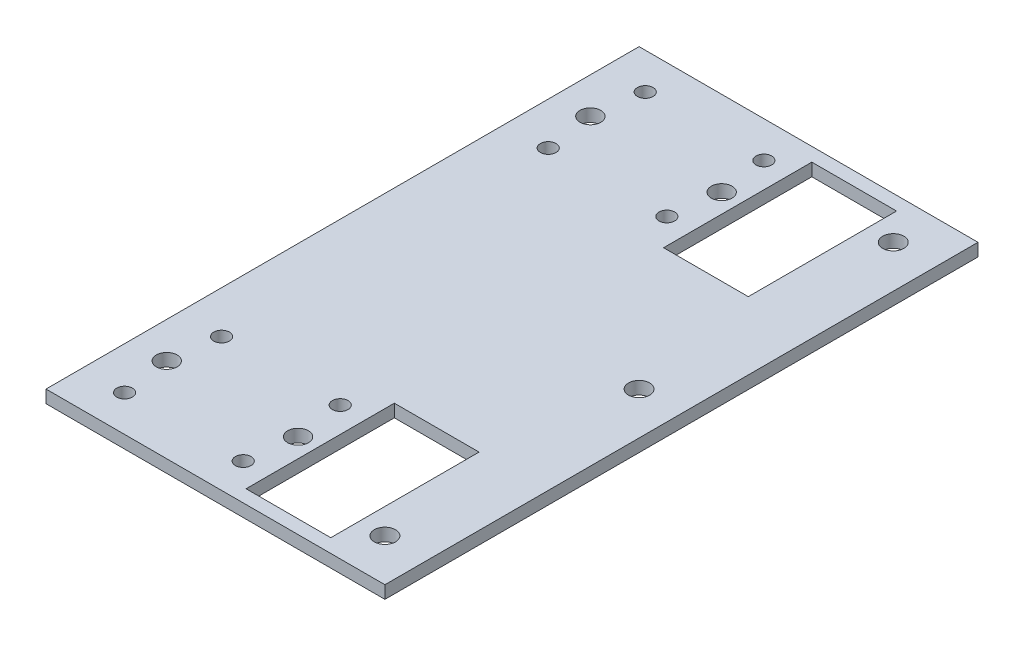
ISO-10303-21;
HEADER;
FILE_DESCRIPTION(('STEP AP214'),'2;1');
FILE_NAME('part.step','',(''),(''),'','','');
FILE_SCHEMA(('AUTOMOTIVE_DESIGN { 1 0 10303 214 1 1 1 1 }'));
ENDSEC;
DATA;
#1=APPLICATION_CONTEXT('core data for automotive mechanical design processes');
#2=APPLICATION_PROTOCOL_DEFINITION('international standard','automotive_design',2000,#1);
#3=PRODUCT_CONTEXT('',#1,'mechanical');
#4=PRODUCT('Part','Part','',(#3));
#5=PRODUCT_RELATED_PRODUCT_CATEGORY('part','',(#4));
#6=PRODUCT_DEFINITION_FORMATION('','',#4);
#7=PRODUCT_DEFINITION_CONTEXT('part definition',#1,'design');
#8=PRODUCT_DEFINITION('design','',#6,#7);
#9=PRODUCT_DEFINITION_SHAPE('','',#8);
#10=(LENGTH_UNIT() NAMED_UNIT(*) SI_UNIT(.MILLI.,.METRE.));
#11=(NAMED_UNIT(*) PLANE_ANGLE_UNIT() SI_UNIT($,.RADIAN.));
#12=(NAMED_UNIT(*) SI_UNIT($,.STERADIAN.) SOLID_ANGLE_UNIT());
#13=UNCERTAINTY_MEASURE_WITH_UNIT(LENGTH_MEASURE(1.E-05),#10,'distance_accuracy_value','');
#14=(GEOMETRIC_REPRESENTATION_CONTEXT(3) GLOBAL_UNCERTAINTY_ASSIGNED_CONTEXT((#13)) GLOBAL_UNIT_ASSIGNED_CONTEXT((#10,
#11,#12)) REPRESENTATION_CONTEXT('',''));
#15=CARTESIAN_POINT('',(0.,0.,0.));
#16=DIRECTION('',(0.,0.,1.));
#17=DIRECTION('',(1.,0.,0.));
#18=AXIS2_PLACEMENT_3D('',#15,#16,#17);
#19=CARTESIAN_POINT('',(40.,3.,0.));
#20=DIRECTION('',(-1.,0.,0.));
#21=DIRECTION('',(0.,0.,1.));
#22=AXIS2_PLACEMENT_3D('',#19,#20,#21);
#23=PLANE('',#22);
#24=DIRECTION('',(0.,0.,-1.));
#25=VECTOR('',#24,1.);
#26=CARTESIAN_POINT('',(40.,0.,0.));
#27=LINE('',#26,#25);
#28=CARTESIAN_POINT('',(40.,0.,70.));
#29=VERTEX_POINT('',#28);
#30=CARTESIAN_POINT('',(40.,0.,-70.));
#31=VERTEX_POINT('',#30);
#32=EDGE_CURVE('E294',#29,#31,#27,.T.);
#33=ORIENTED_EDGE('',*,*,#32,.T.);
#34=DIRECTION('',(0.,-1.,0.));
#35=VECTOR('',#34,1.);
#36=CARTESIAN_POINT('',(40.,3.,-70.));
#37=LINE('',#36,#35);
#38=CARTESIAN_POINT('',(40.,3.,-70.));
#39=VERTEX_POINT('',#38);
#40=EDGE_CURVE('E361',#39,#31,#37,.T.);
#41=ORIENTED_EDGE('',*,*,#40,.F.);
#42=DIRECTION('',(0.,0.,-1.));
#43=VECTOR('',#42,1.);
#44=CARTESIAN_POINT('',(40.,3.,0.));
#45=LINE('',#44,#43);
#46=CARTESIAN_POINT('',(40.,3.,70.));
#47=VERTEX_POINT('',#46);
#48=EDGE_CURVE('E220',#47,#39,#45,.T.);
#49=ORIENTED_EDGE('',*,*,#48,.F.);
#50=DIRECTION('',(0.,-1.,0.));
#51=VECTOR('',#50,1.);
#52=CARTESIAN_POINT('',(40.,3.,70.));
#53=LINE('',#52,#51);
#54=EDGE_CURVE('E278',#47,#29,#53,.T.);
#55=ORIENTED_EDGE('',*,*,#54,.T.);
#56=EDGE_LOOP('',(#33,#41,#49,#55));
#57=FACE_BOUND('',#56,.T.);
#58=ADVANCED_FACE('F46',(#57),#23,.F.);
#59=CARTESIAN_POINT('',(0.,3.,-70.));
#60=DIRECTION('',(0.,0.,-1.));
#61=DIRECTION('',(-1.,0.,0.));
#62=AXIS2_PLACEMENT_3D('',#59,#60,#61);
#63=PLANE('',#62);
#64=DIRECTION('',(1.,0.,0.));
#65=VECTOR('',#64,1.);
#66=CARTESIAN_POINT('',(0.,0.,-70.));
#67=LINE('',#66,#65);
#68=CARTESIAN_POINT('',(-40.,0.,-70.));
#69=VERTEX_POINT('',#68);
#70=EDGE_CURVE('E298',#69,#31,#67,.T.);
#71=ORIENTED_EDGE('',*,*,#70,.F.);
#72=DIRECTION('',(0.,-1.,0.));
#73=VECTOR('',#72,1.);
#74=CARTESIAN_POINT('',(-40.,3.,-70.));
#75=LINE('',#74,#73);
#76=CARTESIAN_POINT('',(-40.,3.,-70.));
#77=VERTEX_POINT('',#76);
#78=EDGE_CURVE('E358',#77,#69,#75,.T.);
#79=ORIENTED_EDGE('',*,*,#78,.F.);
#80=DIRECTION('',(1.,0.,0.));
#81=VECTOR('',#80,1.);
#82=CARTESIAN_POINT('',(0.,3.,-70.));
#83=LINE('',#82,#81);
#84=EDGE_CURVE('E223',#77,#39,#83,.T.);
#85=ORIENTED_EDGE('',*,*,#84,.T.);
#86=ORIENTED_EDGE('',*,*,#40,.T.);
#87=EDGE_LOOP('',(#71,#79,#85,#86));
#88=FACE_BOUND('',#87,.T.);
#89=ADVANCED_FACE('F407',(#88),#63,.T.);
#90=CARTESIAN_POINT('',(-40.,3.,0.));
#91=DIRECTION('',(-1.,0.,0.));
#92=DIRECTION('',(0.,0.,1.));
#93=AXIS2_PLACEMENT_3D('',#90,#91,#92);
#94=PLANE('',#93);
#95=DIRECTION('',(0.,0.,-1.));
#96=VECTOR('',#95,1.);
#97=CARTESIAN_POINT('',(-40.,0.,0.));
#98=LINE('',#97,#96);
#99=CARTESIAN_POINT('',(-40.,0.,70.));
#100=VERTEX_POINT('',#99);
#101=EDGE_CURVE('E302',#100,#69,#98,.T.);
#102=ORIENTED_EDGE('',*,*,#101,.F.);
#103=DIRECTION('',(0.,-1.,0.));
#104=VECTOR('',#103,1.);
#105=CARTESIAN_POINT('',(-40.,3.,70.));
#106=LINE('',#105,#104);
#107=CARTESIAN_POINT('',(-40.,3.,70.));
#108=VERTEX_POINT('',#107);
#109=EDGE_CURVE('E355',#108,#100,#106,.T.);
#110=ORIENTED_EDGE('',*,*,#109,.F.);
#111=DIRECTION('',(0.,0.,-1.));
#112=VECTOR('',#111,1.);
#113=CARTESIAN_POINT('',(-40.,3.,0.));
#114=LINE('',#113,#112);
#115=EDGE_CURVE('E227',#108,#77,#114,.T.);
#116=ORIENTED_EDGE('',*,*,#115,.T.);
#117=ORIENTED_EDGE('',*,*,#78,.T.);
#118=EDGE_LOOP('',(#102,#110,#116,#117));
#119=FACE_BOUND('',#118,.T.);
#120=ADVANCED_FACE('F413',(#119),#94,.T.);
#121=CARTESIAN_POINT('',(-0.499999999999992,3.,-50.));
#122=DIRECTION('',(0.,-1.,0.));
#123=DIRECTION('',(0.,0.,-1.));
#124=AXIS2_PLACEMENT_3D('',#121,#122,#123);
#125=CYLINDRICAL_SURFACE('',#124,2.45);
#126=CARTESIAN_POINT('',(-0.499999999999992,3.,-50.));
#127=DIRECTION('',(0.,1.,0.));
#128=DIRECTION('',(0.,0.,1.));
#129=AXIS2_PLACEMENT_3D('',#126,#127,#128);
#130=CIRCLE('',#129,2.45);
#131=CARTESIAN_POINT('',(-0.499999999999992,3.,-47.55));
#132=VERTEX_POINT('',#131);
#133=EDGE_CURVE('E270',#132,#132,#130,.T.);
#134=ORIENTED_EDGE('',*,*,#133,.T.);
#135=EDGE_LOOP('',(#134));
#136=FACE_BOUND('',#135,.T.);
#137=CARTESIAN_POINT('',(-0.499999999999992,0.,-50.));
#138=DIRECTION('',(0.,1.,0.));
#139=DIRECTION('',(0.,0.,1.));
#140=AXIS2_PLACEMENT_3D('',#137,#138,#139);
#141=CIRCLE('',#140,2.45);
#142=CARTESIAN_POINT('',(-0.499999999999992,0.,-47.55));
#143=VERTEX_POINT('',#142);
#144=EDGE_CURVE('E345',#143,#143,#141,.T.);
#145=ORIENTED_EDGE('',*,*,#144,.F.);
#146=EDGE_LOOP('',(#145));
#147=FACE_BOUND('',#146,.T.);
#148=ADVANCED_FACE('F480',(#136,#147),#125,.F.);
#149=CARTESIAN_POINT('',(-2.00000000000001,3.,-61.45));
#150=DIRECTION('',(0.,-1.,0.));
#151=DIRECTION('',(0.,0.,-1.));
#152=AXIS2_PLACEMENT_3D('',#149,#150,#151);
#153=CYLINDRICAL_SURFACE('',#152,1.85);
#154=CARTESIAN_POINT('',(-2.00000000000001,3.,-61.45));
#155=DIRECTION('',(0.,1.,0.));
#156=DIRECTION('',(0.,0.,1.));
#157=AXIS2_PLACEMENT_3D('',#154,#155,#156);
#158=CIRCLE('',#157,1.85);
#159=CARTESIAN_POINT('',(-2.00000000000001,3.,-59.6));
#160=VERTEX_POINT('',#159);
#161=EDGE_CURVE('E266',#160,#160,#158,.F.);
#162=ORIENTED_EDGE('',*,*,#161,.F.);
#163=EDGE_LOOP('',(#162));
#164=FACE_BOUND('',#163,.T.);
#165=CARTESIAN_POINT('',(-2.00000000000001,0.,-61.45));
#166=DIRECTION('',(0.,1.,0.));
#167=DIRECTION('',(0.,0.,1.));
#168=AXIS2_PLACEMENT_3D('',#165,#166,#167);
#169=CIRCLE('',#168,1.85);
#170=CARTESIAN_POINT('',(-2.00000000000001,0.,-59.6));
#171=VERTEX_POINT('',#170);
#172=EDGE_CURVE('E341',#171,#171,#169,.F.);
#173=ORIENTED_EDGE('',*,*,#172,.T.);
#174=EDGE_LOOP('',(#173));
#175=FACE_BOUND('',#174,.T.);
#176=ADVANCED_FACE('F483',(#164,#175),#153,.F.);
#177=CARTESIAN_POINT('',(-2.00000000000001,3.,-38.55));
#178=DIRECTION('',(0.,-1.,0.));
#179=DIRECTION('',(0.,0.,-1.));
#180=AXIS2_PLACEMENT_3D('',#177,#178,#179);
#181=CYLINDRICAL_SURFACE('',#180,1.85);
#182=CARTESIAN_POINT('',(-2.00000000000001,3.,-38.55));
#183=DIRECTION('',(0.,1.,0.));
#184=DIRECTION('',(0.,0.,1.));
#185=AXIS2_PLACEMENT_3D('',#182,#183,#184);
#186=CIRCLE('',#185,1.85);
#187=CARTESIAN_POINT('',(-2.00000000000001,3.,-36.7));
#188=VERTEX_POINT('',#187);
#189=EDGE_CURVE('E262',#188,#188,#186,.T.);
#190=ORIENTED_EDGE('',*,*,#189,.T.);
#191=EDGE_LOOP('',(#190));
#192=FACE_BOUND('',#191,.T.);
#193=CARTESIAN_POINT('',(-2.00000000000001,0.,-38.55));
#194=DIRECTION('',(0.,1.,0.));
#195=DIRECTION('',(0.,0.,1.));
#196=AXIS2_PLACEMENT_3D('',#193,#194,#195);
#197=CIRCLE('',#196,1.85);
#198=CARTESIAN_POINT('',(-2.00000000000001,0.,-36.7));
#199=VERTEX_POINT('',#198);
#200=EDGE_CURVE('E337',#199,#199,#197,.T.);
#201=ORIENTED_EDGE('',*,*,#200,.F.);
#202=EDGE_LOOP('',(#201));
#203=FACE_BOUND('',#202,.T.);
#204=ADVANCED_FACE('F487',(#192,#203),#181,.F.);
#205=CARTESIAN_POINT('',(-30.,3.,-38.55));
#206=DIRECTION('',(0.,-1.,0.));
#207=DIRECTION('',(0.,0.,-1.));
#208=AXIS2_PLACEMENT_3D('',#205,#206,#207);
#209=CYLINDRICAL_SURFACE('',#208,1.85);
#210=CARTESIAN_POINT('',(-30.,3.,-38.55));
#211=DIRECTION('',(0.,1.,0.));
#212=DIRECTION('',(0.,0.,1.));
#213=AXIS2_PLACEMENT_3D('',#210,#211,#212);
#214=CIRCLE('',#213,1.85);
#215=CARTESIAN_POINT('',(-30.,3.,-36.7));
#216=VERTEX_POINT('',#215);
#217=EDGE_CURVE('E258',#216,#216,#214,.F.);
#218=ORIENTED_EDGE('',*,*,#217,.F.);
#219=EDGE_LOOP('',(#218));
#220=FACE_BOUND('',#219,.T.);
#221=CARTESIAN_POINT('',(-30.,0.,-38.55));
#222=DIRECTION('',(0.,1.,0.));
#223=DIRECTION('',(0.,0.,1.));
#224=AXIS2_PLACEMENT_3D('',#221,#222,#223);
#225=CIRCLE('',#224,1.85);
#226=CARTESIAN_POINT('',(-30.,0.,-36.7));
#227=VERTEX_POINT('',#226);
#228=EDGE_CURVE('E333',#227,#227,#225,.F.);
#229=ORIENTED_EDGE('',*,*,#228,.T.);
#230=EDGE_LOOP('',(#229));
#231=FACE_BOUND('',#230,.T.);
#232=ADVANCED_FACE('F491',(#220,#231),#209,.F.);
#233=CARTESIAN_POINT('',(-30.,3.,61.4500000000001));
#234=DIRECTION('',(0.,-1.,0.));
#235=DIRECTION('',(0.,0.,-1.));
#236=AXIS2_PLACEMENT_3D('',#233,#234,#235);
#237=CYLINDRICAL_SURFACE('',#236,1.85);
#238=CARTESIAN_POINT('',(-30.,3.,61.4500000000001));
#239=DIRECTION('',(0.,1.,0.));
#240=DIRECTION('',(0.,0.,1.));
#241=AXIS2_PLACEMENT_3D('',#238,#239,#240);
#242=CIRCLE('',#241,1.85);
#243=CARTESIAN_POINT('',(-30.,3.,63.3000000000001));
#244=VERTEX_POINT('',#243);
#245=EDGE_CURVE('E254',#244,#244,#242,.F.);
#246=ORIENTED_EDGE('',*,*,#245,.F.);
#247=EDGE_LOOP('',(#246));
#248=FACE_BOUND('',#247,.T.);
#249=CARTESIAN_POINT('',(-30.,0.,61.4500000000001));
#250=DIRECTION('',(0.,1.,0.));
#251=DIRECTION('',(0.,0.,1.));
#252=AXIS2_PLACEMENT_3D('',#249,#250,#251);
#253=CIRCLE('',#252,1.85);
#254=CARTESIAN_POINT('',(-30.,0.,63.3000000000001));
#255=VERTEX_POINT('',#254);
#256=EDGE_CURVE('E329',#255,#255,#253,.F.);
#257=ORIENTED_EDGE('',*,*,#256,.T.);
#258=EDGE_LOOP('',(#257));
#259=FACE_BOUND('',#258,.T.);
#260=ADVANCED_FACE('F495',(#248,#259),#237,.F.);
#261=CARTESIAN_POINT('',(-31.5,3.,50.));
#262=DIRECTION('',(0.,-1.,0.));
#263=DIRECTION('',(0.,0.,-1.));
#264=AXIS2_PLACEMENT_3D('',#261,#262,#263);
#265=CYLINDRICAL_SURFACE('',#264,2.45);
#266=CARTESIAN_POINT('',(-31.5,3.,50.));
#267=DIRECTION('',(0.,1.,0.));
#268=DIRECTION('',(0.,0.,1.));
#269=AXIS2_PLACEMENT_3D('',#266,#267,#268);
#270=CIRCLE('',#269,2.45);
#271=CARTESIAN_POINT('',(-31.5,3.,52.4500000000001));
#272=VERTEX_POINT('',#271);
#273=EDGE_CURVE('E250',#272,#272,#270,.T.);
#274=ORIENTED_EDGE('',*,*,#273,.T.);
#275=EDGE_LOOP('',(#274));
#276=FACE_BOUND('',#275,.T.);
#277=CARTESIAN_POINT('',(-31.5,0.,50.));
#278=DIRECTION('',(0.,1.,0.));
#279=DIRECTION('',(0.,0.,1.));
#280=AXIS2_PLACEMENT_3D('',#277,#278,#279);
#281=CIRCLE('',#280,2.45);
#282=CARTESIAN_POINT('',(-31.5,0.,52.4500000000001));
#283=VERTEX_POINT('',#282);
#284=EDGE_CURVE('E325',#283,#283,#281,.T.);
#285=ORIENTED_EDGE('',*,*,#284,.F.);
#286=EDGE_LOOP('',(#285));
#287=FACE_BOUND('',#286,.T.);
#288=ADVANCED_FACE('F499',(#276,#287),#265,.F.);
#289=CARTESIAN_POINT('',(-30.,3.,38.55));
#290=DIRECTION('',(0.,-1.,0.));
#291=DIRECTION('',(0.,0.,-1.));
#292=AXIS2_PLACEMENT_3D('',#289,#290,#291);
#293=CYLINDRICAL_SURFACE('',#292,1.85);
#294=CARTESIAN_POINT('',(-30.,3.,38.55));
#295=DIRECTION('',(0.,1.,0.));
#296=DIRECTION('',(0.,0.,1.));
#297=AXIS2_PLACEMENT_3D('',#294,#295,#296);
#298=CIRCLE('',#297,1.85);
#299=CARTESIAN_POINT('',(-30.,3.,40.4));
#300=VERTEX_POINT('',#299);
#301=EDGE_CURVE('E246',#300,#300,#298,.T.);
#302=ORIENTED_EDGE('',*,*,#301,.T.);
#303=EDGE_LOOP('',(#302));
#304=FACE_BOUND('',#303,.T.);
#305=CARTESIAN_POINT('',(-30.,0.,38.55));
#306=DIRECTION('',(0.,1.,0.));
#307=DIRECTION('',(0.,0.,1.));
#308=AXIS2_PLACEMENT_3D('',#305,#306,#307);
#309=CIRCLE('',#308,1.85);
#310=CARTESIAN_POINT('',(-30.,0.,40.4));
#311=VERTEX_POINT('',#310);
#312=EDGE_CURVE('E321',#311,#311,#309,.T.);
#313=ORIENTED_EDGE('',*,*,#312,.F.);
#314=EDGE_LOOP('',(#313));
#315=FACE_BOUND('',#314,.T.);
#316=ADVANCED_FACE('F503',(#304,#315),#293,.F.);
#317=CARTESIAN_POINT('',(-2.00000000000001,3.,61.4500000000001));
#318=DIRECTION('',(0.,-1.,0.));
#319=DIRECTION('',(0.,0.,-1.));
#320=AXIS2_PLACEMENT_3D('',#317,#318,#319);
#321=CYLINDRICAL_SURFACE('',#320,1.85);
#322=CARTESIAN_POINT('',(-2.00000000000001,3.,61.4500000000001));
#323=DIRECTION('',(0.,1.,0.));
#324=DIRECTION('',(0.,0.,1.));
#325=AXIS2_PLACEMENT_3D('',#322,#323,#324);
#326=CIRCLE('',#325,1.85);
#327=CARTESIAN_POINT('',(-2.00000000000001,3.,63.3000000000001));
#328=VERTEX_POINT('',#327);
#329=EDGE_CURVE('E242',#328,#328,#326,.T.);
#330=ORIENTED_EDGE('',*,*,#329,.T.);
#331=EDGE_LOOP('',(#330));
#332=FACE_BOUND('',#331,.T.);
#333=CARTESIAN_POINT('',(-2.00000000000001,0.,61.4500000000001));
#334=DIRECTION('',(0.,1.,0.));
#335=DIRECTION('',(0.,0.,1.));
#336=AXIS2_PLACEMENT_3D('',#333,#334,#335);
#337=CIRCLE('',#336,1.85);
#338=CARTESIAN_POINT('',(-2.00000000000001,0.,63.3000000000001));
#339=VERTEX_POINT('',#338);
#340=EDGE_CURVE('E317',#339,#339,#337,.T.);
#341=ORIENTED_EDGE('',*,*,#340,.F.);
#342=EDGE_LOOP('',(#341));
#343=FACE_BOUND('',#342,.T.);
#344=ADVANCED_FACE('F507',(#332,#343),#321,.F.);
#345=CARTESIAN_POINT('',(-2.00000000000001,3.,38.55));
#346=DIRECTION('',(0.,-1.,0.));
#347=DIRECTION('',(0.,0.,-1.));
#348=AXIS2_PLACEMENT_3D('',#345,#346,#347);
#349=CYLINDRICAL_SURFACE('',#348,1.85);
#350=CARTESIAN_POINT('',(-2.00000000000001,3.,38.55));
#351=DIRECTION('',(0.,1.,0.));
#352=DIRECTION('',(0.,0.,1.));
#353=AXIS2_PLACEMENT_3D('',#350,#351,#352);
#354=CIRCLE('',#353,1.85);
#355=CARTESIAN_POINT('',(-2.00000000000001,3.,40.4));
#356=VERTEX_POINT('',#355);
#357=EDGE_CURVE('E238',#356,#356,#354,.F.);
#358=ORIENTED_EDGE('',*,*,#357,.F.);
#359=EDGE_LOOP('',(#358));
#360=FACE_BOUND('',#359,.T.);
#361=CARTESIAN_POINT('',(-2.00000000000001,0.,38.55));
#362=DIRECTION('',(0.,1.,0.));
#363=DIRECTION('',(0.,0.,1.));
#364=AXIS2_PLACEMENT_3D('',#361,#362,#363);
#365=CIRCLE('',#364,1.85);
#366=CARTESIAN_POINT('',(-2.00000000000001,0.,40.4));
#367=VERTEX_POINT('',#366);
#368=EDGE_CURVE('E313',#367,#367,#365,.F.);
#369=ORIENTED_EDGE('',*,*,#368,.T.);
#370=EDGE_LOOP('',(#369));
#371=FACE_BOUND('',#370,.T.);
#372=ADVANCED_FACE('F511',(#360,#371),#349,.F.);
#373=CARTESIAN_POINT('',(-0.499999999999992,3.,50.));
#374=DIRECTION('',(0.,-1.,0.));
#375=DIRECTION('',(0.,0.,-1.));
#376=AXIS2_PLACEMENT_3D('',#373,#374,#375);
#377=CYLINDRICAL_SURFACE('',#376,2.45);
#378=CARTESIAN_POINT('',(-0.499999999999992,3.,50.));
#379=DIRECTION('',(0.,1.,0.));
#380=DIRECTION('',(0.,0.,1.));
#381=AXIS2_PLACEMENT_3D('',#378,#379,#380);
#382=CIRCLE('',#381,2.45);
#383=CARTESIAN_POINT('',(-0.499999999999992,3.,52.4500000000001));
#384=VERTEX_POINT('',#383);
#385=EDGE_CURVE('E234',#384,#384,#382,.F.);
#386=ORIENTED_EDGE('',*,*,#385,.F.);
#387=EDGE_LOOP('',(#386));
#388=FACE_BOUND('',#387,.T.);
#389=CARTESIAN_POINT('',(-0.499999999999992,0.,50.));
#390=DIRECTION('',(0.,1.,0.));
#391=DIRECTION('',(0.,0.,1.));
#392=AXIS2_PLACEMENT_3D('',#389,#390,#391);
#393=CIRCLE('',#392,2.45);
#394=CARTESIAN_POINT('',(-0.499999999999992,0.,52.4500000000001));
#395=VERTEX_POINT('',#394);
#396=EDGE_CURVE('E309',#395,#395,#393,.F.);
#397=ORIENTED_EDGE('',*,*,#396,.T.);
#398=EDGE_LOOP('',(#397));
#399=FACE_BOUND('',#398,.T.);
#400=ADVANCED_FACE('F515',(#388,#399),#377,.F.);
#401=CARTESIAN_POINT('',(0.,3.,70.));
#402=DIRECTION('',(0.,0.,-1.));
#403=DIRECTION('',(-1.,0.,0.));
#404=AXIS2_PLACEMENT_3D('',#401,#402,#403);
#405=PLANE('',#404);
#406=DIRECTION('',(1.,0.,0.));
#407=VECTOR('',#406,1.);
#408=CARTESIAN_POINT('',(0.,0.,70.));
#409=LINE('',#408,#407);
#410=EDGE_CURVE('E306',#100,#29,#409,.T.);
#411=ORIENTED_EDGE('',*,*,#410,.T.);
#412=ORIENTED_EDGE('',*,*,#54,.F.);
#413=DIRECTION('',(1.,0.,0.));
#414=VECTOR('',#413,1.);
#415=CARTESIAN_POINT('',(0.,3.,70.));
#416=LINE('',#415,#414);
#417=EDGE_CURVE('E231',#108,#47,#416,.T.);
#418=ORIENTED_EDGE('',*,*,#417,.F.);
#419=ORIENTED_EDGE('',*,*,#109,.T.);
#420=EDGE_LOOP('',(#411,#412,#418,#419));
#421=FACE_BOUND('',#420,.T.);
#422=ADVANCED_FACE('F422',(#421),#405,.F.);
#423=CARTESIAN_POINT('',(30.0000000000006,3.,0.));
#424=DIRECTION('',(0.,-1.,0.));
#425=DIRECTION('',(0.,0.,-1.));
#426=AXIS2_PLACEMENT_3D('',#423,#424,#425);
#427=CYLINDRICAL_SURFACE('',#426,2.5);
#428=CARTESIAN_POINT('',(30.0000000000006,3.,0.));
#429=DIRECTION('',(0.,1.,0.));
#430=DIRECTION('',(0.,0.,1.));
#431=AXIS2_PLACEMENT_3D('',#428,#429,#430);
#432=CIRCLE('',#431,2.5);
#433=CARTESIAN_POINT('',(30.0000000000006,3.,2.49999999999999));
#434=VERTEX_POINT('',#433);
#435=EDGE_CURVE('E216',#434,#434,#432,.T.);
#436=ORIENTED_EDGE('',*,*,#435,.T.);
#437=EDGE_LOOP('',(#436));
#438=FACE_BOUND('',#437,.T.);
#439=CARTESIAN_POINT('',(30.0000000000006,0.,0.));
#440=DIRECTION('',(0.,1.,0.));
#441=DIRECTION('',(0.,0.,1.));
#442=AXIS2_PLACEMENT_3D('',#439,#440,#441);
#443=CIRCLE('',#442,2.5);
#444=CARTESIAN_POINT('',(30.0000000000006,0.,2.49999999999999));
#445=VERTEX_POINT('',#444);
#446=EDGE_CURVE('E290',#445,#445,#443,.T.);
#447=ORIENTED_EDGE('',*,*,#446,.F.);
#448=EDGE_LOOP('',(#447));
#449=FACE_BOUND('',#448,.T.);
#450=ADVANCED_FACE('F418',(#438,#449),#427,.F.);
#451=CARTESIAN_POINT('',(30.0000000000012,3.,60.));
#452=DIRECTION('',(0.,-1.,0.));
#453=DIRECTION('',(0.,0.,-1.));
#454=AXIS2_PLACEMENT_3D('',#451,#452,#453);
#455=CYLINDRICAL_SURFACE('',#454,2.5);
#456=CARTESIAN_POINT('',(30.0000000000012,3.,60.));
#457=DIRECTION('',(0.,1.,0.));
#458=DIRECTION('',(0.,0.,1.));
#459=AXIS2_PLACEMENT_3D('',#456,#457,#458);
#460=CIRCLE('',#459,2.5);
#461=CARTESIAN_POINT('',(30.0000000000012,3.,62.5));
#462=VERTEX_POINT('',#461);
#463=EDGE_CURVE('E212',#462,#462,#460,.T.);
#464=ORIENTED_EDGE('',*,*,#463,.T.);
#465=EDGE_LOOP('',(#464));
#466=FACE_BOUND('',#465,.T.);
#467=CARTESIAN_POINT('',(30.0000000000012,0.,60.));
#468=DIRECTION('',(0.,1.,0.));
#469=DIRECTION('',(0.,0.,1.));
#470=AXIS2_PLACEMENT_3D('',#467,#468,#469);
#471=CIRCLE('',#470,2.5);
#472=CARTESIAN_POINT('',(30.0000000000012,0.,62.5));
#473=VERTEX_POINT('',#472);
#474=EDGE_CURVE('E286',#473,#473,#471,.T.);
#475=ORIENTED_EDGE('',*,*,#474,.F.);
#476=EDGE_LOOP('',(#475));
#477=FACE_BOUND('',#476,.T.);
#478=ADVANCED_FACE('F421',(#466,#477),#455,.F.);
#479=CARTESIAN_POINT('',(30.,3.,-60.));
#480=DIRECTION('',(0.,-1.,0.));
#481=DIRECTION('',(0.,0.,-1.));
#482=AXIS2_PLACEMENT_3D('',#479,#480,#481);
#483=CYLINDRICAL_SURFACE('',#482,2.5);
#484=CARTESIAN_POINT('',(30.,3.,-60.));
#485=DIRECTION('',(0.,1.,0.));
#486=DIRECTION('',(0.,0.,1.));
#487=AXIS2_PLACEMENT_3D('',#484,#485,#486);
#488=CIRCLE('',#487,2.5);
#489=CARTESIAN_POINT('',(30.,3.,-57.5));
#490=VERTEX_POINT('',#489);
#491=EDGE_CURVE('E207',#490,#490,#488,.T.);
#492=ORIENTED_EDGE('',*,*,#491,.T.);
#493=EDGE_LOOP('',(#492));
#494=FACE_BOUND('',#493,.T.);
#495=CARTESIAN_POINT('',(30.,0.,-60.));
#496=DIRECTION('',(0.,1.,0.));
#497=DIRECTION('',(0.,0.,1.));
#498=AXIS2_PLACEMENT_3D('',#495,#496,#497);
#499=CIRCLE('',#498,2.5);
#500=CARTESIAN_POINT('',(30.,0.,-57.5));
#501=VERTEX_POINT('',#500);
#502=EDGE_CURVE('E282',#501,#501,#499,.T.);
#503=ORIENTED_EDGE('',*,*,#502,.F.);
#504=EDGE_LOOP('',(#503));
#505=FACE_BOUND('',#504,.T.);
#506=ADVANCED_FACE('F425',(#494,#505),#483,.F.);
#507=CARTESIAN_POINT('',(-30.,3.,-61.45));
#508=DIRECTION('',(0.,-1.,0.));
#509=DIRECTION('',(0.,0.,-1.));
#510=AXIS2_PLACEMENT_3D('',#507,#508,#509);
#511=CYLINDRICAL_SURFACE('',#510,1.85);
#512=CARTESIAN_POINT('',(-30.,3.,-61.45));
#513=DIRECTION('',(0.,1.,0.));
#514=DIRECTION('',(0.,0.,1.));
#515=AXIS2_PLACEMENT_3D('',#512,#513,#514);
#516=CIRCLE('',#515,1.85);
#517=CARTESIAN_POINT('',(-30.,3.,-59.6));
#518=VERTEX_POINT('',#517);
#519=EDGE_CURVE('E203',#518,#518,#516,.T.);
#520=ORIENTED_EDGE('',*,*,#519,.T.);
#521=EDGE_LOOP('',(#520));
#522=FACE_BOUND('',#521,.T.);
#523=CARTESIAN_POINT('',(-30.,0.,-61.45));
#524=DIRECTION('',(0.,1.,0.));
#525=DIRECTION('',(0.,0.,1.));
#526=AXIS2_PLACEMENT_3D('',#523,#524,#525);
#527=CIRCLE('',#526,1.85);
#528=CARTESIAN_POINT('',(-30.,0.,-59.6));
#529=VERTEX_POINT('',#528);
#530=EDGE_CURVE('E172',#529,#529,#527,.T.);
#531=ORIENTED_EDGE('',*,*,#530,.F.);
#532=EDGE_LOOP('',(#531));
#533=FACE_BOUND('',#532,.T.);
#534=ADVANCED_FACE('F48',(#522,#533),#511,.F.);
#535=CARTESIAN_POINT('',(-31.5,3.,-50.));
#536=DIRECTION('',(0.,-1.,0.));
#537=DIRECTION('',(0.,0.,-1.));
#538=AXIS2_PLACEMENT_3D('',#535,#536,#537);
#539=CYLINDRICAL_SURFACE('',#538,2.45);
#540=CARTESIAN_POINT('',(-31.5,3.,-50.));
#541=DIRECTION('',(0.,1.,0.));
#542=DIRECTION('',(0.,0.,1.));
#543=AXIS2_PLACEMENT_3D('',#540,#541,#542);
#544=CIRCLE('',#543,2.45);
#545=CARTESIAN_POINT('',(-31.5,3.,-47.55));
#546=VERTEX_POINT('',#545);
#547=EDGE_CURVE('E274',#546,#546,#544,.F.);
#548=ORIENTED_EDGE('',*,*,#547,.F.);
#549=EDGE_LOOP('',(#548));
#550=FACE_BOUND('',#549,.T.);
#551=CARTESIAN_POINT('',(-31.5,0.,-50.));
#552=DIRECTION('',(0.,1.,0.));
#553=DIRECTION('',(0.,0.,1.));
#554=AXIS2_PLACEMENT_3D('',#551,#552,#553);
#555=CIRCLE('',#554,2.45);
#556=CARTESIAN_POINT('',(-31.5,0.,-47.55));
#557=VERTEX_POINT('',#556);
#558=EDGE_CURVE('E208',#557,#557,#555,.F.);
#559=ORIENTED_EDGE('',*,*,#558,.T.);
#560=EDGE_LOOP('',(#559));
#561=FACE_BOUND('',#560,.T.);
#562=ADVANCED_FACE('F432',(#550,#561),#539,.F.);
#563=CARTESIAN_POINT('',(0.,3.,0.));
#564=DIRECTION('',(0.,1.,0.));
#565=DIRECTION('',(0.,0.,1.));
#566=AXIS2_PLACEMENT_3D('',#563,#564,#565);
#567=PLANE('',#566);
#568=DIRECTION('',(0.,0.,1.));
#569=VECTOR('',#568,1.);
#570=CARTESIAN_POINT('',(4.00000000000061,3.,-31.775));
#571=LINE('',#570,#569);
#572=CARTESIAN_POINT('',(4.00000000000061,3.,-66.775));
#573=VERTEX_POINT('',#572);
#574=CARTESIAN_POINT('',(4.00000000000061,3.,-31.775));
#575=VERTEX_POINT('',#574);
#576=EDGE_CURVE('E62',#573,#575,#571,.T.);
#577=ORIENTED_EDGE('',*,*,#576,.F.);
#578=DIRECTION('',(-1.,0.,0.));
#579=VECTOR('',#578,1.);
#580=CARTESIAN_POINT('',(4.00000000000061,3.,-66.775));
#581=LINE('',#580,#579);
#582=CARTESIAN_POINT('',(24.0000000000006,3.,-66.775));
#583=VERTEX_POINT('',#582);
#584=EDGE_CURVE('E162',#583,#573,#581,.T.);
#585=ORIENTED_EDGE('',*,*,#584,.F.);
#586=DIRECTION('',(0.,0.,-1.));
#587=VECTOR('',#586,1.);
#588=CARTESIAN_POINT('',(24.0000000000006,3.,-31.775));
#589=LINE('',#588,#587);
#590=CARTESIAN_POINT('',(24.0000000000006,3.,-31.775));
#591=VERTEX_POINT('',#590);
#592=EDGE_CURVE('E143',#591,#583,#589,.T.);
#593=ORIENTED_EDGE('',*,*,#592,.F.);
#594=DIRECTION('',(1.,0.,0.));
#595=VECTOR('',#594,1.);
#596=CARTESIAN_POINT('',(4.00000000000061,3.,-31.775));
#597=LINE('',#596,#595);
#598=EDGE_CURVE('E154',#575,#591,#597,.T.);
#599=ORIENTED_EDGE('',*,*,#598,.F.);
#600=EDGE_LOOP('',(#577,#585,#593,#599));
#601=FACE_BOUND('',#600,.T.);
#602=DIRECTION('',(0.,0.,-1.));
#603=VECTOR('',#602,1.);
#604=CARTESIAN_POINT('',(24.0000000000006,3.,31.775));
#605=LINE('',#604,#603);
#606=CARTESIAN_POINT('',(24.0000000000006,3.,66.775));
#607=VERTEX_POINT('',#606);
#608=CARTESIAN_POINT('',(24.0000000000006,3.,31.775));
#609=VERTEX_POINT('',#608);
#610=EDGE_CURVE('E70',#607,#609,#605,.T.);
#611=ORIENTED_EDGE('',*,*,#610,.F.);
#612=DIRECTION('',(1.,0.,0.));
#613=VECTOR('',#612,1.);
#614=CARTESIAN_POINT('',(4.00000000000061,3.,66.775));
#615=LINE('',#614,#613);
#616=CARTESIAN_POINT('',(4.00000000000061,3.,66.775));
#617=VERTEX_POINT('',#616);
#618=EDGE_CURVE('E180',#617,#607,#615,.T.);
#619=ORIENTED_EDGE('',*,*,#618,.F.);
#620=DIRECTION('',(0.,0.,1.));
#621=VECTOR('',#620,1.);
#622=CARTESIAN_POINT('',(4.00000000000061,3.,31.775));
#623=LINE('',#622,#621);
#624=CARTESIAN_POINT('',(4.00000000000061,3.,31.775));
#625=VERTEX_POINT('',#624);
#626=EDGE_CURVE('E193',#625,#617,#623,.T.);
#627=ORIENTED_EDGE('',*,*,#626,.F.);
#628=DIRECTION('',(-1.,0.,0.));
#629=VECTOR('',#628,1.);
#630=CARTESIAN_POINT('',(4.00000000000061,3.,31.775));
#631=LINE('',#630,#629);
#632=EDGE_CURVE('E197',#609,#625,#631,.T.);
#633=ORIENTED_EDGE('',*,*,#632,.F.);
#634=EDGE_LOOP('',(#611,#619,#627,#633));
#635=FACE_BOUND('',#634,.T.);
#636=ORIENTED_EDGE('',*,*,#519,.F.);
#637=EDGE_LOOP('',(#636));
#638=FACE_BOUND('',#637,.T.);
#639=ORIENTED_EDGE('',*,*,#491,.F.);
#640=EDGE_LOOP('',(#639));
#641=FACE_BOUND('',#640,.T.);
#642=ORIENTED_EDGE('',*,*,#463,.F.);
#643=EDGE_LOOP('',(#642));
#644=FACE_BOUND('',#643,.T.);
#645=ORIENTED_EDGE('',*,*,#435,.F.);
#646=EDGE_LOOP('',(#645));
#647=FACE_BOUND('',#646,.T.);
#648=ORIENTED_EDGE('',*,*,#48,.T.);
#649=ORIENTED_EDGE('',*,*,#84,.F.);
#650=ORIENTED_EDGE('',*,*,#115,.F.);
#651=ORIENTED_EDGE('',*,*,#417,.T.);
#652=EDGE_LOOP('',(#648,#649,#650,#651));
#653=FACE_BOUND('',#652,.T.);
#654=ORIENTED_EDGE('',*,*,#385,.T.);
#655=EDGE_LOOP('',(#654));
#656=FACE_BOUND('',#655,.T.);
#657=ORIENTED_EDGE('',*,*,#357,.T.);
#658=EDGE_LOOP('',(#657));
#659=FACE_BOUND('',#658,.T.);
#660=ORIENTED_EDGE('',*,*,#329,.F.);
#661=EDGE_LOOP('',(#660));
#662=FACE_BOUND('',#661,.T.);
#663=ORIENTED_EDGE('',*,*,#301,.F.);
#664=EDGE_LOOP('',(#663));
#665=FACE_BOUND('',#664,.T.);
#666=ORIENTED_EDGE('',*,*,#273,.F.);
#667=EDGE_LOOP('',(#666));
#668=FACE_BOUND('',#667,.T.);
#669=ORIENTED_EDGE('',*,*,#245,.T.);
#670=EDGE_LOOP('',(#669));
#671=FACE_BOUND('',#670,.T.);
#672=ORIENTED_EDGE('',*,*,#217,.T.);
#673=EDGE_LOOP('',(#672));
#674=FACE_BOUND('',#673,.T.);
#675=ORIENTED_EDGE('',*,*,#189,.F.);
#676=EDGE_LOOP('',(#675));
#677=FACE_BOUND('',#676,.T.);
#678=ORIENTED_EDGE('',*,*,#161,.T.);
#679=EDGE_LOOP('',(#678));
#680=FACE_BOUND('',#679,.T.);
#681=ORIENTED_EDGE('',*,*,#133,.F.);
#682=EDGE_LOOP('',(#681));
#683=FACE_BOUND('',#682,.T.);
#684=ORIENTED_EDGE('',*,*,#547,.T.);
#685=EDGE_LOOP('',(#684));
#686=FACE_BOUND('',#685,.T.);
#687=ADVANCED_FACE('F159',(#601,#635,#638,#641,#644,#647,#653,#656,#659,#662,#665,#668,#671,
#674,#677,#680,#683,#686),#567,.T.);
#688=CARTESIAN_POINT('',(0.,0.,0.));
#689=DIRECTION('',(0.,1.,0.));
#690=DIRECTION('',(0.,0.,1.));
#691=AXIS2_PLACEMENT_3D('',#688,#689,#690);
#692=PLANE('',#691);
#693=DIRECTION('',(-1.,0.,0.));
#694=VECTOR('',#693,1.);
#695=CARTESIAN_POINT('',(0.,0.,-66.775));
#696=LINE('',#695,#694);
#697=CARTESIAN_POINT('',(24.0000000000006,0.,-66.775));
#698=VERTEX_POINT('',#697);
#699=CARTESIAN_POINT('',(4.00000000000061,0.,-66.775));
#700=VERTEX_POINT('',#699);
#701=EDGE_CURVE('E55',#698,#700,#696,.T.);
#702=ORIENTED_EDGE('',*,*,#701,.T.);
#703=DIRECTION('',(0.,0.,1.));
#704=VECTOR('',#703,1.);
#705=CARTESIAN_POINT('',(4.00000000000061,0.,0.));
#706=LINE('',#705,#704);
#707=CARTESIAN_POINT('',(4.00000000000061,0.,-31.775));
#708=VERTEX_POINT('',#707);
#709=EDGE_CURVE('E11',#700,#708,#706,.T.);
#710=ORIENTED_EDGE('',*,*,#709,.T.);
#711=DIRECTION('',(1.,0.,0.));
#712=VECTOR('',#711,1.);
#713=CARTESIAN_POINT('',(0.,0.,-31.775));
#714=LINE('',#713,#712);
#715=CARTESIAN_POINT('',(24.0000000000006,0.,-31.775));
#716=VERTEX_POINT('',#715);
#717=EDGE_CURVE('E380',#708,#716,#714,.T.);
#718=ORIENTED_EDGE('',*,*,#717,.T.);
#719=DIRECTION('',(0.,0.,-1.));
#720=VECTOR('',#719,1.);
#721=CARTESIAN_POINT('',(24.0000000000006,0.,0.));
#722=LINE('',#721,#720);
#723=EDGE_CURVE('E146',#716,#698,#722,.T.);
#724=ORIENTED_EDGE('',*,*,#723,.T.);
#725=EDGE_LOOP('',(#702,#710,#718,#724));
#726=FACE_BOUND('',#725,.T.);
#727=DIRECTION('',(1.,0.,0.));
#728=VECTOR('',#727,1.);
#729=CARTESIAN_POINT('',(0.,0.,66.775));
#730=LINE('',#729,#728);
#731=CARTESIAN_POINT('',(4.00000000000061,0.,66.775));
#732=VERTEX_POINT('',#731);
#733=CARTESIAN_POINT('',(24.0000000000006,0.,66.775));
#734=VERTEX_POINT('',#733);
#735=EDGE_CURVE('E372',#732,#734,#730,.T.);
#736=ORIENTED_EDGE('',*,*,#735,.T.);
#737=DIRECTION('',(0.,0.,-1.));
#738=VECTOR('',#737,1.);
#739=CARTESIAN_POINT('',(24.0000000000006,0.,0.));
#740=LINE('',#739,#738);
#741=CARTESIAN_POINT('',(24.0000000000006,0.,31.775));
#742=VERTEX_POINT('',#741);
#743=EDGE_CURVE('E376',#734,#742,#740,.T.);
#744=ORIENTED_EDGE('',*,*,#743,.T.);
#745=DIRECTION('',(-1.,0.,0.));
#746=VECTOR('',#745,1.);
#747=CARTESIAN_POINT('',(0.,0.,31.775));
#748=LINE('',#747,#746);
#749=CARTESIAN_POINT('',(4.00000000000061,0.,31.775));
#750=VERTEX_POINT('',#749);
#751=EDGE_CURVE('E364',#742,#750,#748,.T.);
#752=ORIENTED_EDGE('',*,*,#751,.T.);
#753=DIRECTION('',(0.,0.,1.));
#754=VECTOR('',#753,1.);
#755=CARTESIAN_POINT('',(4.00000000000061,0.,0.));
#756=LINE('',#755,#754);
#757=EDGE_CURVE('E368',#750,#732,#756,.T.);
#758=ORIENTED_EDGE('',*,*,#757,.T.);
#759=EDGE_LOOP('',(#736,#744,#752,#758));
#760=FACE_BOUND('',#759,.T.);
#761=ORIENTED_EDGE('',*,*,#530,.T.);
#762=EDGE_LOOP('',(#761));
#763=FACE_BOUND('',#762,.T.);
#764=ORIENTED_EDGE('',*,*,#502,.T.);
#765=EDGE_LOOP('',(#764));
#766=FACE_BOUND('',#765,.T.);
#767=ORIENTED_EDGE('',*,*,#474,.T.);
#768=EDGE_LOOP('',(#767));
#769=FACE_BOUND('',#768,.T.);
#770=ORIENTED_EDGE('',*,*,#446,.T.);
#771=EDGE_LOOP('',(#770));
#772=FACE_BOUND('',#771,.T.);
#773=ORIENTED_EDGE('',*,*,#32,.F.);
#774=ORIENTED_EDGE('',*,*,#410,.F.);
#775=ORIENTED_EDGE('',*,*,#101,.T.);
#776=ORIENTED_EDGE('',*,*,#70,.T.);
#777=EDGE_LOOP('',(#773,#774,#775,#776));
#778=FACE_BOUND('',#777,.T.);
#779=ORIENTED_EDGE('',*,*,#396,.F.);
#780=EDGE_LOOP('',(#779));
#781=FACE_BOUND('',#780,.T.);
#782=ORIENTED_EDGE('',*,*,#368,.F.);
#783=EDGE_LOOP('',(#782));
#784=FACE_BOUND('',#783,.T.);
#785=ORIENTED_EDGE('',*,*,#340,.T.);
#786=EDGE_LOOP('',(#785));
#787=FACE_BOUND('',#786,.T.);
#788=ORIENTED_EDGE('',*,*,#312,.T.);
#789=EDGE_LOOP('',(#788));
#790=FACE_BOUND('',#789,.T.);
#791=ORIENTED_EDGE('',*,*,#284,.T.);
#792=EDGE_LOOP('',(#791));
#793=FACE_BOUND('',#792,.T.);
#794=ORIENTED_EDGE('',*,*,#256,.F.);
#795=EDGE_LOOP('',(#794));
#796=FACE_BOUND('',#795,.T.);
#797=ORIENTED_EDGE('',*,*,#228,.F.);
#798=EDGE_LOOP('',(#797));
#799=FACE_BOUND('',#798,.T.);
#800=ORIENTED_EDGE('',*,*,#200,.T.);
#801=EDGE_LOOP('',(#800));
#802=FACE_BOUND('',#801,.T.);
#803=ORIENTED_EDGE('',*,*,#172,.F.);
#804=EDGE_LOOP('',(#803));
#805=FACE_BOUND('',#804,.T.);
#806=ORIENTED_EDGE('',*,*,#144,.T.);
#807=EDGE_LOOP('',(#806));
#808=FACE_BOUND('',#807,.T.);
#809=ORIENTED_EDGE('',*,*,#558,.F.);
#810=EDGE_LOOP('',(#809));
#811=FACE_BOUND('',#810,.T.);
#812=ADVANCED_FACE('F387',(#726,#760,#763,#766,#769,#772,#778,#781,#784,#787,#790,#793,#796,
#799,#802,#805,#808,#811),#692,.F.);
#813=CARTESIAN_POINT('',(24.0000000000006,-7.,31.775));
#814=DIRECTION('',(1.,0.,0.));
#815=DIRECTION('',(0.,0.,-1.));
#816=AXIS2_PLACEMENT_3D('',#813,#814,#815);
#817=PLANE('',#816);
#818=DIRECTION('',(0.,1.,0.));
#819=VECTOR('',#818,1.);
#820=CARTESIAN_POINT('',(24.0000000000006,-7.,66.775));
#821=LINE('',#820,#819);
#822=EDGE_CURVE('E187',#734,#607,#821,.T.);
#823=ORIENTED_EDGE('',*,*,#822,.T.);
#824=ORIENTED_EDGE('',*,*,#610,.T.);
#825=DIRECTION('',(0.,1.,0.));
#826=VECTOR('',#825,1.);
#827=CARTESIAN_POINT('',(24.0000000000006,-7.,31.775));
#828=LINE('',#827,#826);
#829=EDGE_CURVE('E177',#742,#609,#828,.T.);
#830=ORIENTED_EDGE('',*,*,#829,.F.);
#831=ORIENTED_EDGE('',*,*,#743,.F.);
#832=EDGE_LOOP('',(#823,#824,#830,#831));
#833=FACE_BOUND('',#832,.T.);
#834=ADVANCED_FACE('F440',(#833),#817,.F.);
#835=CARTESIAN_POINT('',(4.00000000000061,-7.,66.775));
#836=DIRECTION('',(0.,0.,1.));
#837=DIRECTION('',(1.,0.,0.));
#838=AXIS2_PLACEMENT_3D('',#835,#836,#837);
#839=PLANE('',#838);
#840=DIRECTION('',(0.,1.,0.));
#841=VECTOR('',#840,1.);
#842=CARTESIAN_POINT('',(4.00000000000061,-7.,66.775));
#843=LINE('',#842,#841);
#844=EDGE_CURVE('E184',#732,#617,#843,.T.);
#845=ORIENTED_EDGE('',*,*,#844,.T.);
#846=ORIENTED_EDGE('',*,*,#618,.T.);
#847=ORIENTED_EDGE('',*,*,#822,.F.);
#848=ORIENTED_EDGE('',*,*,#735,.F.);
#849=EDGE_LOOP('',(#845,#846,#847,#848));
#850=FACE_BOUND('',#849,.T.);
#851=ADVANCED_FACE('F693',(#850),#839,.F.);
#852=CARTESIAN_POINT('',(4.00000000000061,-7.,31.775));
#853=DIRECTION('',(-1.,0.,0.));
#854=DIRECTION('',(0.,0.,1.));
#855=AXIS2_PLACEMENT_3D('',#852,#853,#854);
#856=PLANE('',#855);
#857=DIRECTION('',(0.,1.,0.));
#858=VECTOR('',#857,1.);
#859=CARTESIAN_POINT('',(4.00000000000061,-7.,31.775));
#860=LINE('',#859,#858);
#861=EDGE_CURVE('E181',#750,#625,#860,.T.);
#862=ORIENTED_EDGE('',*,*,#861,.T.);
#863=ORIENTED_EDGE('',*,*,#626,.T.);
#864=ORIENTED_EDGE('',*,*,#844,.F.);
#865=ORIENTED_EDGE('',*,*,#757,.F.);
#866=EDGE_LOOP('',(#862,#863,#864,#865));
#867=FACE_BOUND('',#866,.T.);
#868=ADVANCED_FACE('F401',(#867),#856,.F.);
#869=CARTESIAN_POINT('',(4.00000000000061,-7.,31.775));
#870=DIRECTION('',(0.,0.,-1.));
#871=DIRECTION('',(-1.,0.,0.));
#872=AXIS2_PLACEMENT_3D('',#869,#870,#871);
#873=PLANE('',#872);
#874=ORIENTED_EDGE('',*,*,#829,.T.);
#875=ORIENTED_EDGE('',*,*,#632,.T.);
#876=ORIENTED_EDGE('',*,*,#861,.F.);
#877=ORIENTED_EDGE('',*,*,#751,.F.);
#878=EDGE_LOOP('',(#874,#875,#876,#877));
#879=FACE_BOUND('',#878,.T.);
#880=ADVANCED_FACE('F394',(#879),#873,.F.);
#881=CARTESIAN_POINT('',(4.00000000000061,-7.,-31.775));
#882=DIRECTION('',(-1.,0.,0.));
#883=DIRECTION('',(0.,0.,1.));
#884=AXIS2_PLACEMENT_3D('',#881,#882,#883);
#885=PLANE('',#884);
#886=DIRECTION('',(0.,1.,0.));
#887=VECTOR('',#886,1.);
#888=CARTESIAN_POINT('',(4.00000000000061,-7.,-66.775));
#889=LINE('',#888,#887);
#890=EDGE_CURVE('E169',#700,#573,#889,.T.);
#891=ORIENTED_EDGE('',*,*,#890,.T.);
#892=ORIENTED_EDGE('',*,*,#576,.T.);
#893=DIRECTION('',(0.,1.,0.));
#894=VECTOR('',#893,1.);
#895=CARTESIAN_POINT('',(4.00000000000061,-7.,-31.775));
#896=LINE('',#895,#894);
#897=EDGE_CURVE('E151',#708,#575,#896,.T.);
#898=ORIENTED_EDGE('',*,*,#897,.F.);
#899=ORIENTED_EDGE('',*,*,#709,.F.);
#900=EDGE_LOOP('',(#891,#892,#898,#899));
#901=FACE_BOUND('',#900,.T.);
#902=ADVANCED_FACE('F392',(#901),#885,.F.);
#903=CARTESIAN_POINT('',(4.00000000000061,-7.,-66.775));
#904=DIRECTION('',(0.,0.,-1.));
#905=DIRECTION('',(-1.,0.,0.));
#906=AXIS2_PLACEMENT_3D('',#903,#904,#905);
#907=PLANE('',#906);
#908=DIRECTION('',(0.,1.,0.));
#909=VECTOR('',#908,1.);
#910=CARTESIAN_POINT('',(24.0000000000006,-7.,-66.775));
#911=LINE('',#910,#909);
#912=EDGE_CURVE('E150',#698,#583,#911,.T.);
#913=ORIENTED_EDGE('',*,*,#912,.T.);
#914=ORIENTED_EDGE('',*,*,#584,.T.);
#915=ORIENTED_EDGE('',*,*,#890,.F.);
#916=ORIENTED_EDGE('',*,*,#701,.F.);
#917=EDGE_LOOP('',(#913,#914,#915,#916));
#918=FACE_BOUND('',#917,.T.);
#919=ADVANCED_FACE('F391',(#918),#907,.F.);
#920=CARTESIAN_POINT('',(24.0000000000006,-7.,-31.775));
#921=DIRECTION('',(1.,0.,0.));
#922=DIRECTION('',(0.,0.,-1.));
#923=AXIS2_PLACEMENT_3D('',#920,#921,#922);
#924=PLANE('',#923);
#925=DIRECTION('',(0.,1.,0.));
#926=VECTOR('',#925,1.);
#927=CARTESIAN_POINT('',(24.0000000000006,-7.,-31.775));
#928=LINE('',#927,#926);
#929=EDGE_CURVE('E138',#716,#591,#928,.T.);
#930=ORIENTED_EDGE('',*,*,#929,.T.);
#931=ORIENTED_EDGE('',*,*,#592,.T.);
#932=ORIENTED_EDGE('',*,*,#912,.F.);
#933=ORIENTED_EDGE('',*,*,#723,.F.);
#934=EDGE_LOOP('',(#930,#931,#932,#933));
#935=FACE_BOUND('',#934,.T.);
#936=ADVANCED_FACE('F140',(#935),#924,.F.);
#937=CARTESIAN_POINT('',(4.00000000000061,-7.,-31.775));
#938=DIRECTION('',(0.,0.,1.));
#939=DIRECTION('',(1.,0.,0.));
#940=AXIS2_PLACEMENT_3D('',#937,#938,#939);
#941=PLANE('',#940);
#942=ORIENTED_EDGE('',*,*,#897,.T.);
#943=ORIENTED_EDGE('',*,*,#598,.T.);
#944=ORIENTED_EDGE('',*,*,#929,.F.);
#945=ORIENTED_EDGE('',*,*,#717,.F.);
#946=EDGE_LOOP('',(#942,#943,#944,#945));
#947=FACE_BOUND('',#946,.T.);
#948=ADVANCED_FACE('F155',(#947),#941,.F.);
#949=CLOSED_SHELL('',(#58,#89,#120,#148,#176,#204,#232,#260,#288,#316,#344,#372,#400,#422,#450,
#478,#506,#534,#562,#687,#812,#834,#851,#868,#880,#902,#919,#936,#948));
#950=MANIFOLD_SOLID_BREP('B2',#949);
#951=ADVANCED_BREP_SHAPE_REPRESENTATION('',(#18,#950),#14);
#952=SHAPE_DEFINITION_REPRESENTATION(#9,#951);
ENDSEC;
END-ISO-10303-21;
